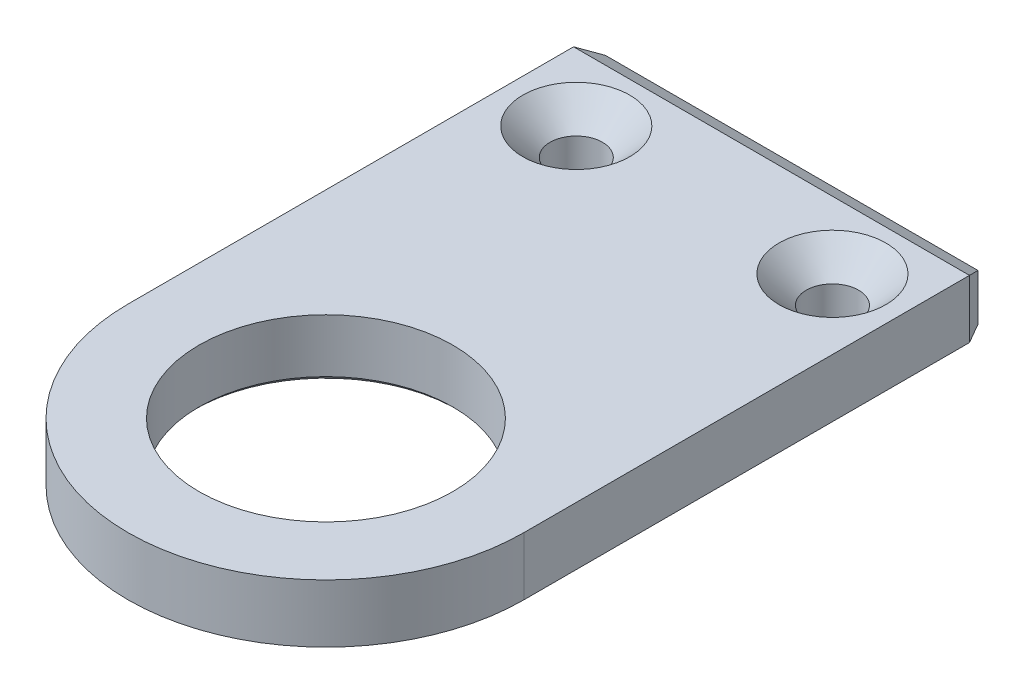
ISO-10303-21;
HEADER;
FILE_DESCRIPTION(('STEP AP214'),'2;1');
FILE_NAME('part.step','',(''),(''),'','','');
FILE_SCHEMA(('AUTOMOTIVE_DESIGN { 1 0 10303 214 1 1 1 1 }'));
ENDSEC;
DATA;
#1=APPLICATION_CONTEXT('core data for automotive mechanical design processes');
#2=APPLICATION_PROTOCOL_DEFINITION('international standard','automotive_design',2000,#1);
#3=PRODUCT_CONTEXT('',#1,'mechanical');
#4=PRODUCT('Part','Part','',(#3));
#5=PRODUCT_RELATED_PRODUCT_CATEGORY('part','',(#4));
#6=PRODUCT_DEFINITION_FORMATION('','',#4);
#7=PRODUCT_DEFINITION_CONTEXT('part definition',#1,'design');
#8=PRODUCT_DEFINITION('design','',#6,#7);
#9=PRODUCT_DEFINITION_SHAPE('','',#8);
#10=(LENGTH_UNIT() NAMED_UNIT(*) SI_UNIT(.MILLI.,.METRE.));
#11=(NAMED_UNIT(*) PLANE_ANGLE_UNIT() SI_UNIT($,.RADIAN.));
#12=(NAMED_UNIT(*) SI_UNIT($,.STERADIAN.) SOLID_ANGLE_UNIT());
#13=UNCERTAINTY_MEASURE_WITH_UNIT(LENGTH_MEASURE(1.E-05),#10,'distance_accuracy_value','');
#14=(GEOMETRIC_REPRESENTATION_CONTEXT(3) GLOBAL_UNCERTAINTY_ASSIGNED_CONTEXT((#13)) GLOBAL_UNIT_ASSIGNED_CONTEXT((#10,
#11,#12)) REPRESENTATION_CONTEXT('',''));
#15=CARTESIAN_POINT('',(0.,0.,0.));
#16=DIRECTION('',(0.,0.,1.));
#17=DIRECTION('',(1.,0.,0.));
#18=AXIS2_PLACEMENT_3D('',#15,#16,#17);
#19=CARTESIAN_POINT('',(-17.,-13.7701740241805,14.1999999999995));
#20=DIRECTION('',(1.,0.,0.));
#21=DIRECTION('',(0.,0.,-1.));
#22=AXIS2_PLACEMENT_3D('',#19,#20,#21);
#23=PLANE('',#22);
#24=DIRECTION('',(0.,0.,-1.));
#25=VECTOR('',#24,1.);
#26=CARTESIAN_POINT('',(-17.,57.6,14.1999999999995));
#27=LINE('',#26,#25);
#28=CARTESIAN_POINT('',(-17.,57.6,25.));
#29=VERTEX_POINT('',#28);
#30=CARTESIAN_POINT('',(-17.,57.6,-13.2679491924311));
#31=VERTEX_POINT('',#30);
#32=EDGE_CURVE('E142',#29,#31,#27,.T.);
#33=ORIENTED_EDGE('',*,*,#32,.T.);
#34=DIRECTION('',(0.,-1.,0.));
#35=VECTOR('',#34,1.);
#36=CARTESIAN_POINT('',(-17.,-13.7701740241805,-13.2679491924311));
#37=LINE('',#36,#35);
#38=CARTESIAN_POINT('',(-17.,52.6,-13.2679491924311));
#39=VERTEX_POINT('',#38);
#40=EDGE_CURVE('E173',#31,#39,#37,.T.);
#41=ORIENTED_EDGE('',*,*,#40,.T.);
#42=DIRECTION('',(0.,0.,1.));
#43=VECTOR('',#42,1.);
#44=CARTESIAN_POINT('',(-17.,52.6,14.1999999999995));
#45=LINE('',#44,#43);
#46=CARTESIAN_POINT('',(-17.,52.6,25.));
#47=VERTEX_POINT('',#46);
#48=EDGE_CURVE('E136',#39,#47,#45,.T.);
#49=ORIENTED_EDGE('',*,*,#48,.T.);
#50=DIRECTION('',(0.,1.,0.));
#51=VECTOR('',#50,1.);
#52=CARTESIAN_POINT('',(-17.,-13.7701740241805,25.));
#53=LINE('',#52,#51);
#54=EDGE_CURVE('E137',#47,#29,#53,.T.);
#55=ORIENTED_EDGE('',*,*,#54,.T.);
#56=EDGE_LOOP('',(#33,#41,#49,#55));
#57=FACE_BOUND('',#56,.T.);
#58=ADVANCED_FACE('F63',(#57),#23,.F.);
#59=CARTESIAN_POINT('',(0.,-13.7701740241805,25.));
#60=DIRECTION('',(0.,1.,0.));
#61=DIRECTION('',(0.,0.,1.));
#62=AXIS2_PLACEMENT_3D('',#59,#60,#61);
#63=CYLINDRICAL_SURFACE('',#62,17.);
#64=CARTESIAN_POINT('',(0.,52.6,25.));
#65=DIRECTION('',(0.,1.,0.));
#66=DIRECTION('',(0.,0.,1.));
#67=AXIS2_PLACEMENT_3D('',#64,#65,#66);
#68=CIRCLE('',#67,17.);
#69=CARTESIAN_POINT('',(17.,52.6,25.));
#70=VERTEX_POINT('',#69);
#71=EDGE_CURVE('E134',#70,#47,#68,.F.);
#72=ORIENTED_EDGE('',*,*,#71,.F.);
#73=DIRECTION('',(0.,1.,0.));
#74=VECTOR('',#73,1.);
#75=CARTESIAN_POINT('',(17.,-13.7701740241805,25.));
#76=LINE('',#75,#74);
#77=CARTESIAN_POINT('',(17.,57.6,25.));
#78=VERTEX_POINT('',#77);
#79=EDGE_CURVE('E120',#70,#78,#76,.T.);
#80=ORIENTED_EDGE('',*,*,#79,.T.);
#81=CARTESIAN_POINT('',(0.,57.6,25.));
#82=DIRECTION('',(0.,1.,0.));
#83=DIRECTION('',(0.,0.,1.));
#84=AXIS2_PLACEMENT_3D('',#81,#82,#83);
#85=CIRCLE('',#84,17.);
#86=EDGE_CURVE('E126',#29,#78,#85,.T.);
#87=ORIENTED_EDGE('',*,*,#86,.F.);
#88=ORIENTED_EDGE('',*,*,#54,.F.);
#89=EDGE_LOOP('',(#72,#80,#87,#88));
#90=FACE_BOUND('',#89,.T.);
#91=ADVANCED_FACE('F131',(#90),#63,.T.);
#92=CARTESIAN_POINT('',(17.,-13.7701740241805,14.1999999999995));
#93=DIRECTION('',(-1.,0.,0.));
#94=DIRECTION('',(0.,0.,1.));
#95=AXIS2_PLACEMENT_3D('',#92,#93,#94);
#96=PLANE('',#95);
#97=DIRECTION('',(0.,0.,-1.));
#98=VECTOR('',#97,1.);
#99=CARTESIAN_POINT('',(17.,52.6,14.1999999999995));
#100=LINE('',#99,#98);
#101=CARTESIAN_POINT('',(17.,52.6,-13.2679491924311));
#102=VERTEX_POINT('',#101);
#103=EDGE_CURVE('E225',#70,#102,#100,.T.);
#104=ORIENTED_EDGE('',*,*,#103,.T.);
#105=DIRECTION('',(0.,1.,0.));
#106=VECTOR('',#105,1.);
#107=CARTESIAN_POINT('',(17.,-13.7701740241805,-13.2679491924311));
#108=LINE('',#107,#106);
#109=CARTESIAN_POINT('',(17.,57.6,-13.2679491924311));
#110=VERTEX_POINT('',#109);
#111=EDGE_CURVE('E74',#102,#110,#108,.T.);
#112=ORIENTED_EDGE('',*,*,#111,.T.);
#113=DIRECTION('',(0.,0.,1.));
#114=VECTOR('',#113,1.);
#115=CARTESIAN_POINT('',(17.,57.6,14.1999999999995));
#116=LINE('',#115,#114);
#117=EDGE_CURVE('E117',#110,#78,#116,.T.);
#118=ORIENTED_EDGE('',*,*,#117,.T.);
#119=ORIENTED_EDGE('',*,*,#79,.F.);
#120=EDGE_LOOP('',(#104,#112,#118,#119));
#121=FACE_BOUND('',#120,.T.);
#122=ADVANCED_FACE('F119',(#121),#96,.F.);
#123=CARTESIAN_POINT('',(0.,-13.7701740241805,-15.));
#124=DIRECTION('',(0.,0.,1.));
#125=DIRECTION('',(1.,0.,0.));
#126=AXIS2_PLACEMENT_3D('',#123,#124,#125);
#127=PLANE('',#126);
#128=DIRECTION('',(-1.,0.,0.));
#129=VECTOR('',#128,1.);
#130=CARTESIAN_POINT('',(0.,52.6,-15.));
#131=LINE('',#130,#129);
#132=CARTESIAN_POINT('',(16.,52.6,-15.));
#133=VERTEX_POINT('',#132);
#134=CARTESIAN_POINT('',(-16.,52.6,-15.));
#135=VERTEX_POINT('',#134);
#136=EDGE_CURVE('E159',#133,#135,#131,.T.);
#137=ORIENTED_EDGE('',*,*,#136,.T.);
#138=DIRECTION('',(0.,1.,0.));
#139=VECTOR('',#138,1.);
#140=CARTESIAN_POINT('',(-16.,-13.7701740241805,-15.));
#141=LINE('',#140,#139);
#142=CARTESIAN_POINT('',(-16.,56.6,-15.));
#143=VERTEX_POINT('',#142);
#144=EDGE_CURVE('E169',#135,#143,#141,.T.);
#145=ORIENTED_EDGE('',*,*,#144,.T.);
#146=DIRECTION('',(1.,0.,0.));
#147=VECTOR('',#146,1.);
#148=CARTESIAN_POINT('',(17.,56.6,-15.));
#149=LINE('',#148,#147);
#150=CARTESIAN_POINT('',(16.,56.6,-15.));
#151=VERTEX_POINT('',#150);
#152=EDGE_CURVE('E163',#143,#151,#149,.T.);
#153=ORIENTED_EDGE('',*,*,#152,.T.);
#154=DIRECTION('',(0.,-1.,0.));
#155=VECTOR('',#154,1.);
#156=CARTESIAN_POINT('',(16.,-13.7701740241805,-15.));
#157=LINE('',#156,#155);
#158=EDGE_CURVE('E166',#151,#133,#157,.T.);
#159=ORIENTED_EDGE('',*,*,#158,.T.);
#160=EDGE_LOOP('',(#137,#145,#153,#159));
#161=FACE_BOUND('',#160,.T.);
#162=ADVANCED_FACE('F238',(#161),#127,.F.);
#163=CARTESIAN_POINT('',(0.,57.6,25.));
#164=DIRECTION('',(0.,1.,0.));
#165=DIRECTION('',(0.,0.,1.));
#166=AXIS2_PLACEMENT_3D('',#163,#164,#165);
#167=PLANE('',#166);
#168=CARTESIAN_POINT('',(-11.,57.6,-7.5));
#169=DIRECTION('',(0.,1.,0.));
#170=DIRECTION('',(0.,0.,1.));
#171=AXIS2_PLACEMENT_3D('',#168,#169,#170);
#172=CIRCLE('',#171,4.59);
#173=CARTESIAN_POINT('',(-11.,57.6,-2.91));
#174=VERTEX_POINT('',#173);
#175=EDGE_CURVE('E192',#174,#174,#172,.T.);
#176=ORIENTED_EDGE('',*,*,#175,.F.);
#177=EDGE_LOOP('',(#176));
#178=FACE_BOUND('',#177,.T.);
#179=CARTESIAN_POINT('',(11.,57.6,-7.5));
#180=DIRECTION('',(0.,1.,0.));
#181=DIRECTION('',(0.,0.,1.));
#182=AXIS2_PLACEMENT_3D('',#179,#180,#181);
#183=CIRCLE('',#182,4.59);
#184=CARTESIAN_POINT('',(11.,57.6,-2.91));
#185=VERTEX_POINT('',#184);
#186=EDGE_CURVE('E211',#185,#185,#183,.T.);
#187=ORIENTED_EDGE('',*,*,#186,.F.);
#188=EDGE_LOOP('',(#187));
#189=FACE_BOUND('',#188,.T.);
#190=CARTESIAN_POINT('',(0.,57.6,25.));
#191=DIRECTION('',(0.,1.,0.));
#192=DIRECTION('',(0.,0.,1.));
#193=AXIS2_PLACEMENT_3D('',#190,#191,#192);
#194=CIRCLE('',#193,10.9000000000005);
#195=CARTESIAN_POINT('',(0.,57.6,35.9000000000005));
#196=VERTEX_POINT('',#195);
#197=EDGE_CURVE('E127',#196,#196,#194,.T.);
#198=ORIENTED_EDGE('',*,*,#197,.F.);
#199=EDGE_LOOP('',(#198));
#200=FACE_BOUND('',#199,.T.);
#201=ORIENTED_EDGE('',*,*,#117,.F.);
#202=DIRECTION('',(-1.,0.,0.));
#203=VECTOR('',#202,1.);
#204=CARTESIAN_POINT('',(-17.,57.6,-13.2679491924311));
#205=LINE('',#204,#203);
#206=EDGE_CURVE('E13',#110,#31,#205,.T.);
#207=ORIENTED_EDGE('',*,*,#206,.T.);
#208=ORIENTED_EDGE('',*,*,#32,.F.);
#209=ORIENTED_EDGE('',*,*,#86,.T.);
#210=EDGE_LOOP('',(#201,#207,#208,#209));
#211=FACE_BOUND('',#210,.T.);
#212=ADVANCED_FACE('F140',(#178,#189,#200,#211),#167,.T.);
#213=CARTESIAN_POINT('',(0.,-13.7701740241805,25.));
#214=DIRECTION('',(0.,1.,0.));
#215=DIRECTION('',(0.,0.,1.));
#216=AXIS2_PLACEMENT_3D('',#213,#214,#215);
#217=CYLINDRICAL_SURFACE('',#216,10.9000000000005);
#218=CARTESIAN_POINT('',(0.,53.,25.));
#219=DIRECTION('',(0.,1.,0.));
#220=DIRECTION('',(0.,0.,1.));
#221=AXIS2_PLACEMENT_3D('',#218,#219,#220);
#222=CIRCLE('',#221,10.9000000000005);
#223=CARTESIAN_POINT('',(0.,53.,35.9000000000005));
#224=VERTEX_POINT('',#223);
#225=EDGE_CURVE('E154',#224,#224,#222,.F.);
#226=ORIENTED_EDGE('',*,*,#225,.T.);
#227=EDGE_LOOP('',(#226));
#228=FACE_BOUND('',#227,.T.);
#229=ORIENTED_EDGE('',*,*,#197,.T.);
#230=EDGE_LOOP('',(#229));
#231=FACE_BOUND('',#230,.T.);
#232=ADVANCED_FACE('F235',(#228,#231),#217,.F.);
#233=CARTESIAN_POINT('',(0.,52.6,13.5));
#234=DIRECTION('',(0.,1.,0.));
#235=DIRECTION('',(0.,0.,1.));
#236=AXIS2_PLACEMENT_3D('',#233,#234,#235);
#237=PLANE('',#236);
#238=CARTESIAN_POINT('',(0.,52.6,25.));
#239=DIRECTION('',(0.,1.,0.));
#240=DIRECTION('',(0.,0.,1.));
#241=AXIS2_PLACEMENT_3D('',#238,#239,#240);
#242=CIRCLE('',#241,11.3000000000005);
#243=CARTESIAN_POINT('',(0.,52.6,36.3000000000005));
#244=VERTEX_POINT('',#243);
#245=EDGE_CURVE('E158',#244,#244,#242,.T.);
#246=ORIENTED_EDGE('',*,*,#245,.T.);
#247=EDGE_LOOP('',(#246));
#248=FACE_BOUND('',#247,.T.);
#249=CARTESIAN_POINT('',(-11.,52.6,-7.5));
#250=DIRECTION('',(0.,1.,0.));
#251=DIRECTION('',(0.,0.,1.));
#252=AXIS2_PLACEMENT_3D('',#249,#250,#251);
#253=CIRCLE('',#252,2.25);
#254=CARTESIAN_POINT('',(-11.,52.6,-5.25));
#255=VERTEX_POINT('',#254);
#256=EDGE_CURVE('E205',#255,#255,#253,.T.);
#257=ORIENTED_EDGE('',*,*,#256,.T.);
#258=EDGE_LOOP('',(#257));
#259=FACE_BOUND('',#258,.T.);
#260=CARTESIAN_POINT('',(11.,52.6,-7.5));
#261=DIRECTION('',(0.,1.,0.));
#262=DIRECTION('',(0.,0.,1.));
#263=AXIS2_PLACEMENT_3D('',#260,#261,#262);
#264=CIRCLE('',#263,2.25);
#265=CARTESIAN_POINT('',(11.,52.6,-5.25));
#266=VERTEX_POINT('',#265);
#267=EDGE_CURVE('E219',#266,#266,#264,.T.);
#268=ORIENTED_EDGE('',*,*,#267,.T.);
#269=EDGE_LOOP('',(#268));
#270=FACE_BOUND('',#269,.T.);
#271=ORIENTED_EDGE('',*,*,#48,.F.);
#272=DIRECTION('',(-0.499999999999996,0.,0.866025403784441));
#273=VECTOR('',#272,1.);
#274=CARTESIAN_POINT('',(-16.,52.6,-15.));
#275=LINE('',#274,#273);
#276=EDGE_CURVE('E178',#39,#135,#275,.F.);
#277=ORIENTED_EDGE('',*,*,#276,.T.);
#278=ORIENTED_EDGE('',*,*,#136,.F.);
#279=DIRECTION('',(-0.499999999999996,0.,-0.866025403784441));
#280=VECTOR('',#279,1.);
#281=CARTESIAN_POINT('',(17.,52.6,-13.2679491924311));
#282=LINE('',#281,#280);
#283=EDGE_CURVE('E89',#133,#102,#282,.F.);
#284=ORIENTED_EDGE('',*,*,#283,.T.);
#285=ORIENTED_EDGE('',*,*,#103,.F.);
#286=ORIENTED_EDGE('',*,*,#71,.T.);
#287=EDGE_LOOP('',(#271,#277,#278,#284,#285,#286));
#288=FACE_BOUND('',#287,.T.);
#289=ADVANCED_FACE('F246',(#248,#259,#270,#288),#237,.F.);
#290=CARTESIAN_POINT('',(11.,57.6,-7.5));
#291=DIRECTION('',(0.,1.,0.));
#292=DIRECTION('',(0.,0.,1.));
#293=AXIS2_PLACEMENT_3D('',#290,#291,#292);
#294=CYLINDRICAL_SURFACE('',#293,2.25);
#295=ORIENTED_EDGE('',*,*,#267,.F.);
#296=EDGE_LOOP('',(#295));
#297=FACE_BOUND('',#296,.T.);
#298=CARTESIAN_POINT('',(11.,55.26,-7.5));
#299=DIRECTION('',(0.,1.,0.));
#300=DIRECTION('',(0.,0.,1.));
#301=AXIS2_PLACEMENT_3D('',#298,#299,#300);
#302=CIRCLE('',#301,2.25);
#303=CARTESIAN_POINT('',(11.,55.26,-5.25));
#304=VERTEX_POINT('',#303);
#305=EDGE_CURVE('E215',#304,#304,#302,.T.);
#306=ORIENTED_EDGE('',*,*,#305,.T.);
#307=EDGE_LOOP('',(#306));
#308=FACE_BOUND('',#307,.T.);
#309=ADVANCED_FACE('F289',(#297,#308),#294,.F.);
#310=CARTESIAN_POINT('',(11.,57.6,-7.5));
#311=DIRECTION('',(0.,1.,0.));
#312=DIRECTION('',(0.,0.,1.));
#313=AXIS2_PLACEMENT_3D('',#310,#311,#312);
#314=CONICAL_SURFACE('',#313,4.59,0.785398163397448);
#315=ORIENTED_EDGE('',*,*,#305,.F.);
#316=EDGE_LOOP('',(#315));
#317=FACE_BOUND('',#316,.T.);
#318=ORIENTED_EDGE('',*,*,#186,.T.);
#319=EDGE_LOOP('',(#318));
#320=FACE_BOUND('',#319,.T.);
#321=ADVANCED_FACE('F295',(#317,#320),#314,.F.);
#322=CARTESIAN_POINT('',(-11.,57.6,-7.5));
#323=DIRECTION('',(0.,1.,0.));
#324=DIRECTION('',(0.,0.,1.));
#325=AXIS2_PLACEMENT_3D('',#322,#323,#324);
#326=CYLINDRICAL_SURFACE('',#325,2.25);
#327=ORIENTED_EDGE('',*,*,#256,.F.);
#328=EDGE_LOOP('',(#327));
#329=FACE_BOUND('',#328,.T.);
#330=CARTESIAN_POINT('',(-11.,55.26,-7.5));
#331=DIRECTION('',(0.,1.,0.));
#332=DIRECTION('',(0.,0.,1.));
#333=AXIS2_PLACEMENT_3D('',#330,#331,#332);
#334=CIRCLE('',#333,2.25);
#335=CARTESIAN_POINT('',(-11.,55.26,-5.25));
#336=VERTEX_POINT('',#335);
#337=EDGE_CURVE('E198',#336,#336,#334,.T.);
#338=ORIENTED_EDGE('',*,*,#337,.T.);
#339=EDGE_LOOP('',(#338));
#340=FACE_BOUND('',#339,.T.);
#341=ADVANCED_FACE('F302',(#329,#340),#326,.F.);
#342=CARTESIAN_POINT('',(-11.,57.6,-7.5));
#343=DIRECTION('',(0.,1.,0.));
#344=DIRECTION('',(0.,0.,1.));
#345=AXIS2_PLACEMENT_3D('',#342,#343,#344);
#346=CONICAL_SURFACE('',#345,4.59,0.785398163397448);
#347=ORIENTED_EDGE('',*,*,#337,.F.);
#348=EDGE_LOOP('',(#347));
#349=FACE_BOUND('',#348,.T.);
#350=ORIENTED_EDGE('',*,*,#175,.T.);
#351=EDGE_LOOP('',(#350));
#352=FACE_BOUND('',#351,.T.);
#353=ADVANCED_FACE('F268',(#349,#352),#346,.F.);
#354=CARTESIAN_POINT('',(0.,53.,25.));
#355=DIRECTION('',(0.,-1.,0.));
#356=DIRECTION('',(0.,0.,-1.));
#357=AXIS2_PLACEMENT_3D('',#354,#355,#356);
#358=CONICAL_SURFACE('',#357,10.9000000000005,0.785398163397457);
#359=ORIENTED_EDGE('',*,*,#245,.F.);
#360=EDGE_LOOP('',(#359));
#361=FACE_BOUND('',#360,.T.);
#362=ORIENTED_EDGE('',*,*,#225,.F.);
#363=EDGE_LOOP('',(#362));
#364=FACE_BOUND('',#363,.T.);
#365=ADVANCED_FACE('F264',(#361,#364),#358,.F.);
#366=CARTESIAN_POINT('',(17.,-13.7701740241805,-13.2679491924311));
#367=DIRECTION('',(-0.866025403784441,0.,0.499999999999996));
#368=DIRECTION('',(0.,1.,0.));
#369=AXIS2_PLACEMENT_3D('',#366,#367,#368);
#370=PLANE('',#369);
#371=ORIENTED_EDGE('',*,*,#283,.F.);
#372=ORIENTED_EDGE('',*,*,#158,.F.);
#373=DIRECTION('',(0.447213595499955,0.447213595499956,0.774596669241486));
#374=VECTOR('',#373,1.);
#375=CARTESIAN_POINT('',(12.8,53.4,-20.5425625842204));
#376=LINE('',#375,#374);
#377=EDGE_CURVE('E68',#110,#151,#376,.F.);
#378=ORIENTED_EDGE('',*,*,#377,.F.);
#379=ORIENTED_EDGE('',*,*,#111,.F.);
#380=EDGE_LOOP('',(#371,#372,#378,#379));
#381=FACE_BOUND('',#380,.T.);
#382=ADVANCED_FACE('F66',(#381),#370,.F.);
#383=CARTESIAN_POINT('',(0.,56.6,-15.));
#384=DIRECTION('',(0.,0.86602540378444,-0.499999999999997));
#385=DIRECTION('',(-1.,0.,0.));
#386=AXIS2_PLACEMENT_3D('',#383,#384,#385);
#387=PLANE('',#386);
#388=ORIENTED_EDGE('',*,*,#377,.T.);
#389=ORIENTED_EDGE('',*,*,#152,.F.);
#390=DIRECTION('',(0.447213595499955,-0.447213595499956,-0.774596669241486));
#391=VECTOR('',#390,1.);
#392=CARTESIAN_POINT('',(-12.8,53.4,-20.5425625842204));
#393=LINE('',#392,#391);
#394=EDGE_CURVE('E182',#31,#143,#393,.T.);
#395=ORIENTED_EDGE('',*,*,#394,.F.);
#396=ORIENTED_EDGE('',*,*,#206,.F.);
#397=EDGE_LOOP('',(#388,#389,#395,#396));
#398=FACE_BOUND('',#397,.T.);
#399=ADVANCED_FACE('F276',(#398),#387,.T.);
#400=CARTESIAN_POINT('',(-16.,-13.7701740241805,-15.));
#401=DIRECTION('',(0.866025403784441,0.,0.499999999999996));
#402=DIRECTION('',(0.,1.,0.));
#403=AXIS2_PLACEMENT_3D('',#400,#401,#402);
#404=PLANE('',#403);
#405=ORIENTED_EDGE('',*,*,#276,.F.);
#406=ORIENTED_EDGE('',*,*,#40,.F.);
#407=ORIENTED_EDGE('',*,*,#394,.T.);
#408=ORIENTED_EDGE('',*,*,#144,.F.);
#409=EDGE_LOOP('',(#405,#406,#407,#408));
#410=FACE_BOUND('',#409,.T.);
#411=ADVANCED_FACE('F271',(#410),#404,.F.);
#412=CLOSED_SHELL('',(#58,#91,#122,#162,#212,#232,#289,#309,#321,#341,#353,#365,#382,#399,#411));
#413=MANIFOLD_SOLID_BREP('B2',#412);
#414=ADVANCED_BREP_SHAPE_REPRESENTATION('',(#18,#413),#14);
#415=SHAPE_DEFINITION_REPRESENTATION(#9,#414);
ENDSEC;
END-ISO-10303-21;
